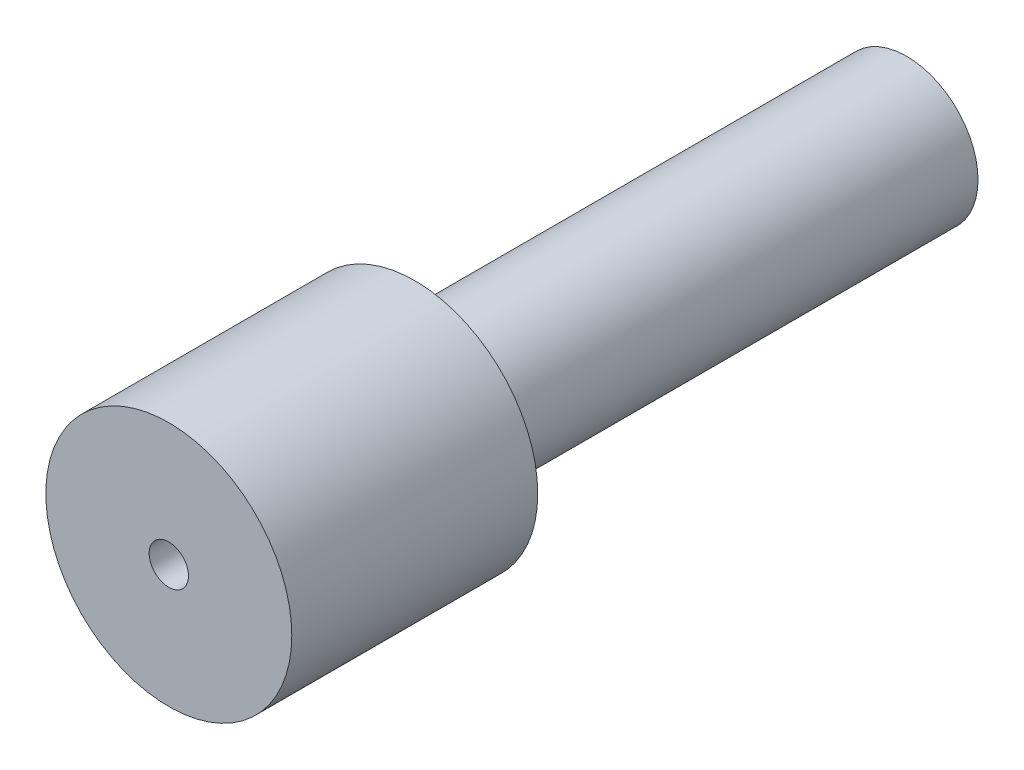
ISO-10303-21;
HEADER;
FILE_DESCRIPTION(('STEP AP214'),'2;1');
FILE_NAME('part.step','',(''),(''),'','','');
FILE_SCHEMA(('AUTOMOTIVE_DESIGN { 1 0 10303 214 1 1 1 1 }'));
ENDSEC;
DATA;
#1=APPLICATION_CONTEXT('core data for automotive mechanical design processes');
#2=APPLICATION_PROTOCOL_DEFINITION('international standard','automotive_design',2000,#1);
#3=PRODUCT_CONTEXT('',#1,'mechanical');
#4=PRODUCT('Part','Part','',(#3));
#5=PRODUCT_RELATED_PRODUCT_CATEGORY('part','',(#4));
#6=PRODUCT_DEFINITION_FORMATION('','',#4);
#7=PRODUCT_DEFINITION_CONTEXT('part definition',#1,'design');
#8=PRODUCT_DEFINITION('design','',#6,#7);
#9=PRODUCT_DEFINITION_SHAPE('','',#8);
#10=(LENGTH_UNIT() NAMED_UNIT(*) SI_UNIT(.MILLI.,.METRE.));
#11=(NAMED_UNIT(*) PLANE_ANGLE_UNIT() SI_UNIT($,.RADIAN.));
#12=(NAMED_UNIT(*) SI_UNIT($,.STERADIAN.) SOLID_ANGLE_UNIT());
#13=UNCERTAINTY_MEASURE_WITH_UNIT(LENGTH_MEASURE(1.E-05),#10,'distance_accuracy_value','');
#14=(GEOMETRIC_REPRESENTATION_CONTEXT(3) GLOBAL_UNCERTAINTY_ASSIGNED_CONTEXT((#13)) GLOBAL_UNIT_ASSIGNED_CONTEXT((#10,
#11,#12)) REPRESENTATION_CONTEXT('',''));
#15=CARTESIAN_POINT('',(0.,0.,0.));
#16=DIRECTION('',(0.,0.,1.));
#17=DIRECTION('',(1.,0.,0.));
#18=AXIS2_PLACEMENT_3D('',#15,#16,#17);
#19=CARTESIAN_POINT('',(0.,0.,0.));
#20=DIRECTION('',(0.,0.,1.));
#21=DIRECTION('',(1.,0.,0.));
#22=AXIS2_PLACEMENT_3D('',#19,#20,#21);
#23=CYLINDRICAL_SURFACE('',#22,1.016);
#24=CARTESIAN_POINT('',(0.,0.,-10.16));
#25=DIRECTION('',(0.,0.,1.));
#26=DIRECTION('',(1.,0.,0.));
#27=AXIS2_PLACEMENT_3D('',#24,#25,#26);
#28=CIRCLE('',#27,1.016);
#29=CARTESIAN_POINT('',(1.016,0.,-10.16));
#30=VERTEX_POINT('',#29);
#31=EDGE_CURVE('E62',#30,#30,#28,.T.);
#32=ORIENTED_EDGE('',*,*,#31,.F.);
#33=EDGE_LOOP('',(#32));
#34=FACE_BOUND('',#33,.T.);
#35=CARTESIAN_POINT('',(0.,0.,0.));
#36=DIRECTION('',(0.,0.,1.));
#37=DIRECTION('',(1.,0.,0.));
#38=AXIS2_PLACEMENT_3D('',#35,#36,#37);
#39=CIRCLE('',#38,1.016);
#40=CARTESIAN_POINT('',(1.016,0.,0.));
#41=VERTEX_POINT('',#40);
#42=EDGE_CURVE('E10',#41,#41,#39,.T.);
#43=ORIENTED_EDGE('',*,*,#42,.T.);
#44=EDGE_LOOP('',(#43));
#45=FACE_BOUND('',#44,.T.);
#46=ADVANCED_FACE('F31',(#34,#45),#23,.F.);
#47=CARTESIAN_POINT('',(-1.016,0.,0.));
#48=DIRECTION('',(0.,0.,-1.));
#49=DIRECTION('',(-1.,0.,0.));
#50=AXIS2_PLACEMENT_3D('',#47,#48,#49);
#51=PLANE('',#50);
#52=ORIENTED_EDGE('',*,*,#42,.F.);
#53=EDGE_LOOP('',(#52));
#54=FACE_BOUND('',#53,.T.);
#55=CARTESIAN_POINT('',(0.,0.,0.));
#56=DIRECTION('',(0.,0.,1.));
#57=DIRECTION('',(1.,0.,0.));
#58=AXIS2_PLACEMENT_3D('',#55,#56,#57);
#59=CIRCLE('',#58,6.35);
#60=CARTESIAN_POINT('',(6.35,0.,0.));
#61=VERTEX_POINT('',#60);
#62=EDGE_CURVE('E37',#61,#61,#59,.T.);
#63=ORIENTED_EDGE('',*,*,#62,.T.);
#64=EDGE_LOOP('',(#63));
#65=FACE_BOUND('',#64,.T.);
#66=ADVANCED_FACE('F69',(#54,#65),#51,.F.);
#67=CARTESIAN_POINT('',(0.,0.,0.));
#68=DIRECTION('',(0.,0.,1.));
#69=DIRECTION('',(1.,0.,0.));
#70=AXIS2_PLACEMENT_3D('',#67,#68,#69);
#71=CYLINDRICAL_SURFACE('',#70,6.35);
#72=ORIENTED_EDGE('',*,*,#62,.F.);
#73=EDGE_LOOP('',(#72));
#74=FACE_BOUND('',#73,.T.);
#75=CARTESIAN_POINT('',(0.,0.,-12.7));
#76=DIRECTION('',(0.,0.,1.));
#77=DIRECTION('',(1.,0.,0.));
#78=AXIS2_PLACEMENT_3D('',#75,#76,#77);
#79=CIRCLE('',#78,6.35);
#80=CARTESIAN_POINT('',(6.35,0.,-12.7));
#81=VERTEX_POINT('',#80);
#82=EDGE_CURVE('E41',#81,#81,#79,.T.);
#83=ORIENTED_EDGE('',*,*,#82,.T.);
#84=EDGE_LOOP('',(#83));
#85=FACE_BOUND('',#84,.T.);
#86=ADVANCED_FACE('F73',(#74,#85),#71,.T.);
#87=CARTESIAN_POINT('',(-6.35,0.,-12.7));
#88=DIRECTION('',(0.,0.,1.));
#89=DIRECTION('',(1.,0.,0.));
#90=AXIS2_PLACEMENT_3D('',#87,#88,#89);
#91=PLANE('',#90);
#92=ORIENTED_EDGE('',*,*,#82,.F.);
#93=EDGE_LOOP('',(#92));
#94=FACE_BOUND('',#93,.T.);
#95=CARTESIAN_POINT('',(0.,0.,-12.7));
#96=DIRECTION('',(0.,0.,1.));
#97=DIRECTION('',(1.,0.,0.));
#98=AXIS2_PLACEMENT_3D('',#95,#96,#97);
#99=CIRCLE('',#98,4.953);
#100=CARTESIAN_POINT('',(4.953,0.,-12.7));
#101=VERTEX_POINT('',#100);
#102=EDGE_CURVE('E45',#101,#101,#99,.T.);
#103=ORIENTED_EDGE('',*,*,#102,.T.);
#104=EDGE_LOOP('',(#103));
#105=FACE_BOUND('',#104,.T.);
#106=ADVANCED_FACE('F78',(#94,#105),#91,.F.);
#107=CARTESIAN_POINT('',(0.,0.,-13.97));
#108=DIRECTION('',(0.,0.,1.));
#109=DIRECTION('',(1.,0.,0.));
#110=AXIS2_PLACEMENT_3D('',#107,#108,#109);
#111=CONICAL_SURFACE('',#110,3.683,0.785398163397447);
#112=ORIENTED_EDGE('',*,*,#102,.F.);
#113=EDGE_LOOP('',(#112));
#114=FACE_BOUND('',#113,.T.);
#115=CARTESIAN_POINT('',(0.,0.,-13.97));
#116=DIRECTION('',(0.,0.,1.));
#117=DIRECTION('',(1.,0.,0.));
#118=AXIS2_PLACEMENT_3D('',#115,#116,#117);
#119=CIRCLE('',#118,3.683);
#120=CARTESIAN_POINT('',(3.683,0.,-13.97));
#121=VERTEX_POINT('',#120);
#122=EDGE_CURVE('E50',#121,#121,#119,.T.);
#123=ORIENTED_EDGE('',*,*,#122,.T.);
#124=EDGE_LOOP('',(#123));
#125=FACE_BOUND('',#124,.T.);
#126=ADVANCED_FACE('F84',(#114,#125),#111,.T.);
#127=CARTESIAN_POINT('',(0.,0.,0.));
#128=DIRECTION('',(0.,0.,1.));
#129=DIRECTION('',(1.,0.,0.));
#130=AXIS2_PLACEMENT_3D('',#127,#128,#129);
#131=CYLINDRICAL_SURFACE('',#130,3.683);
#132=ORIENTED_EDGE('',*,*,#122,.F.);
#133=EDGE_LOOP('',(#132));
#134=FACE_BOUND('',#133,.T.);
#135=CARTESIAN_POINT('',(0.,0.,-38.1));
#136=DIRECTION('',(0.,0.,1.));
#137=DIRECTION('',(1.,0.,0.));
#138=AXIS2_PLACEMENT_3D('',#135,#136,#137);
#139=CIRCLE('',#138,3.683);
#140=CARTESIAN_POINT('',(3.683,0.,-38.1));
#141=VERTEX_POINT('',#140);
#142=EDGE_CURVE('E53',#141,#141,#139,.T.);
#143=ORIENTED_EDGE('',*,*,#142,.T.);
#144=EDGE_LOOP('',(#143));
#145=FACE_BOUND('',#144,.T.);
#146=ADVANCED_FACE('F88',(#134,#145),#131,.T.);
#147=CARTESIAN_POINT('',(-3.683,0.,-38.1));
#148=DIRECTION('',(0.,0.,1.));
#149=DIRECTION('',(1.,0.,0.));
#150=AXIS2_PLACEMENT_3D('',#147,#148,#149);
#151=PLANE('',#150);
#152=ORIENTED_EDGE('',*,*,#142,.F.);
#153=EDGE_LOOP('',(#152));
#154=FACE_BOUND('',#153,.T.);
#155=CARTESIAN_POINT('',(0.,0.,-38.1));
#156=DIRECTION('',(0.,0.,1.));
#157=DIRECTION('',(1.,0.,0.));
#158=AXIS2_PLACEMENT_3D('',#155,#156,#157);
#159=CIRCLE('',#158,2.0955);
#160=CARTESIAN_POINT('',(2.0955,0.,-38.1));
#161=VERTEX_POINT('',#160);
#162=EDGE_CURVE('E56',#161,#161,#159,.T.);
#163=ORIENTED_EDGE('',*,*,#162,.T.);
#164=EDGE_LOOP('',(#163));
#165=FACE_BOUND('',#164,.T.);
#166=ADVANCED_FACE('F92',(#154,#165),#151,.F.);
#167=CARTESIAN_POINT('',(0.,0.,0.));
#168=DIRECTION('',(0.,0.,1.));
#169=DIRECTION('',(1.,0.,0.));
#170=AXIS2_PLACEMENT_3D('',#167,#168,#169);
#171=CYLINDRICAL_SURFACE('',#170,2.0955);
#172=ORIENTED_EDGE('',*,*,#162,.F.);
#173=EDGE_LOOP('',(#172));
#174=FACE_BOUND('',#173,.T.);
#175=CARTESIAN_POINT('',(0.,0.,-10.16));
#176=DIRECTION('',(0.,0.,1.));
#177=DIRECTION('',(1.,0.,0.));
#178=AXIS2_PLACEMENT_3D('',#175,#176,#177);
#179=CIRCLE('',#178,2.0955);
#180=CARTESIAN_POINT('',(2.0955,0.,-10.16));
#181=VERTEX_POINT('',#180);
#182=EDGE_CURVE('E59',#181,#181,#179,.T.);
#183=ORIENTED_EDGE('',*,*,#182,.T.);
#184=EDGE_LOOP('',(#183));
#185=FACE_BOUND('',#184,.T.);
#186=ADVANCED_FACE('F96',(#174,#185),#171,.F.);
#187=CARTESIAN_POINT('',(-2.0955,0.,-10.16));
#188=DIRECTION('',(0.,0.,1.));
#189=DIRECTION('',(1.,0.,0.));
#190=AXIS2_PLACEMENT_3D('',#187,#188,#189);
#191=PLANE('',#190);
#192=ORIENTED_EDGE('',*,*,#182,.F.);
#193=EDGE_LOOP('',(#192));
#194=FACE_BOUND('',#193,.T.);
#195=ORIENTED_EDGE('',*,*,#31,.T.);
#196=EDGE_LOOP('',(#195));
#197=FACE_BOUND('',#196,.T.);
#198=ADVANCED_FACE('F66',(#194,#197),#191,.F.);
#199=CLOSED_SHELL('',(#46,#66,#86,#106,#126,#146,#166,#186,#198));
#200=MANIFOLD_SOLID_BREP('B2',#199);
#201=ADVANCED_BREP_SHAPE_REPRESENTATION('',(#18,#200),#14);
#202=SHAPE_DEFINITION_REPRESENTATION(#9,#201);
ENDSEC;
END-ISO-10303-21;
